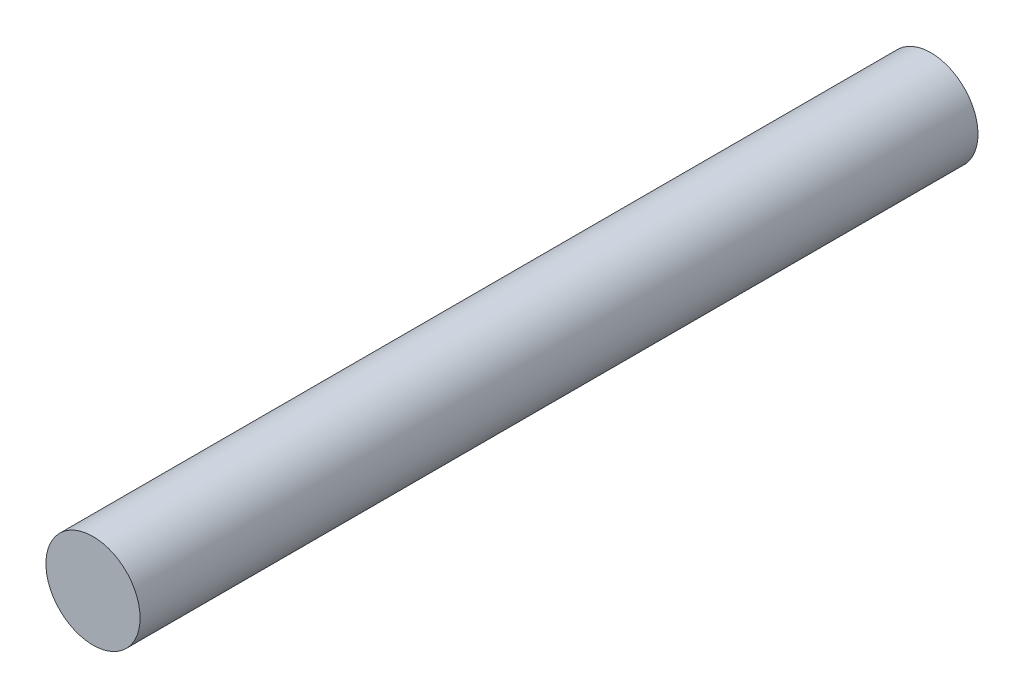
ISO-10303-21;
HEADER;
FILE_DESCRIPTION(('STEP AP214'),'2;1');
FILE_NAME('part.step','',(''),(''),'','','');
FILE_SCHEMA(('AUTOMOTIVE_DESIGN { 1 0 10303 214 1 1 1 1 }'));
ENDSEC;
DATA;
#1=APPLICATION_CONTEXT('core data for automotive mechanical design processes');
#2=APPLICATION_PROTOCOL_DEFINITION('international standard','automotive_design',2000,#1);
#3=PRODUCT_CONTEXT('',#1,'mechanical');
#4=PRODUCT('Part','Part','',(#3));
#5=PRODUCT_RELATED_PRODUCT_CATEGORY('part','',(#4));
#6=PRODUCT_DEFINITION_FORMATION('','',#4);
#7=PRODUCT_DEFINITION_CONTEXT('part definition',#1,'design');
#8=PRODUCT_DEFINITION('design','',#6,#7);
#9=PRODUCT_DEFINITION_SHAPE('','',#8);
#10=(LENGTH_UNIT() NAMED_UNIT(*) SI_UNIT(.MILLI.,.METRE.));
#11=(NAMED_UNIT(*) PLANE_ANGLE_UNIT() SI_UNIT($,.RADIAN.));
#12=(NAMED_UNIT(*) SI_UNIT($,.STERADIAN.) SOLID_ANGLE_UNIT());
#13=UNCERTAINTY_MEASURE_WITH_UNIT(LENGTH_MEASURE(1.E-05),#10,'distance_accuracy_value','');
#14=(GEOMETRIC_REPRESENTATION_CONTEXT(3) GLOBAL_UNCERTAINTY_ASSIGNED_CONTEXT((#13)) GLOBAL_UNIT_ASSIGNED_CONTEXT((#10,
#11,#12)) REPRESENTATION_CONTEXT('',''));
#15=CARTESIAN_POINT('',(0.,0.,0.));
#16=DIRECTION('',(0.,0.,1.));
#17=DIRECTION('',(1.,0.,0.));
#18=AXIS2_PLACEMENT_3D('',#15,#16,#17);
#19=CARTESIAN_POINT('',(0.,0.,30.25));
#20=DIRECTION('',(0.,0.,-1.));
#21=DIRECTION('',(-1.,0.,0.));
#22=AXIS2_PLACEMENT_3D('',#19,#20,#21);
#23=CYLINDRICAL_SURFACE('',#22,3.4);
#24=CARTESIAN_POINT('',(0.,0.,30.25));
#25=DIRECTION('',(0.,0.,1.));
#26=DIRECTION('',(1.,0.,0.));
#27=AXIS2_PLACEMENT_3D('',#24,#25,#26);
#28=CIRCLE('',#27,3.4);
#29=CARTESIAN_POINT('',(3.4,0.,30.25));
#30=VERTEX_POINT('',#29);
#31=EDGE_CURVE('E10',#30,#30,#28,.T.);
#32=ORIENTED_EDGE('',*,*,#31,.F.);
#33=EDGE_LOOP('',(#32));
#34=FACE_BOUND('',#33,.T.);
#35=CARTESIAN_POINT('',(0.,0.,-30.25));
#36=DIRECTION('',(0.,0.,1.));
#37=DIRECTION('',(1.,0.,0.));
#38=AXIS2_PLACEMENT_3D('',#35,#36,#37);
#39=CIRCLE('',#38,3.4);
#40=CARTESIAN_POINT('',(3.4,0.,-30.25));
#41=VERTEX_POINT('',#40);
#42=EDGE_CURVE('E38',#41,#41,#39,.T.);
#43=ORIENTED_EDGE('',*,*,#42,.T.);
#44=EDGE_LOOP('',(#43));
#45=FACE_BOUND('',#44,.T.);
#46=ADVANCED_FACE('F35',(#34,#45),#23,.T.);
#47=CARTESIAN_POINT('',(0.,0.,30.25));
#48=DIRECTION('',(0.,0.,1.));
#49=DIRECTION('',(1.,0.,0.));
#50=AXIS2_PLACEMENT_3D('',#47,#48,#49);
#51=PLANE('',#50);
#52=ORIENTED_EDGE('',*,*,#31,.T.);
#53=EDGE_LOOP('',(#52));
#54=FACE_BOUND('',#53,.T.);
#55=ADVANCED_FACE('F50',(#54),#51,.T.);
#56=CARTESIAN_POINT('',(0.,0.,-30.25));
#57=DIRECTION('',(0.,0.,1.));
#58=DIRECTION('',(1.,0.,0.));
#59=AXIS2_PLACEMENT_3D('',#56,#57,#58);
#60=PLANE('',#59);
#61=ORIENTED_EDGE('',*,*,#42,.F.);
#62=EDGE_LOOP('',(#61));
#63=FACE_BOUND('',#62,.T.);
#64=ADVANCED_FACE('F48',(#63),#60,.F.);
#65=CLOSED_SHELL('',(#46,#55,#64));
#66=MANIFOLD_SOLID_BREP('B2',#65);
#67=ADVANCED_BREP_SHAPE_REPRESENTATION('',(#18,#66),#14);
#68=SHAPE_DEFINITION_REPRESENTATION(#9,#67);
ENDSEC;
END-ISO-10303-21;
